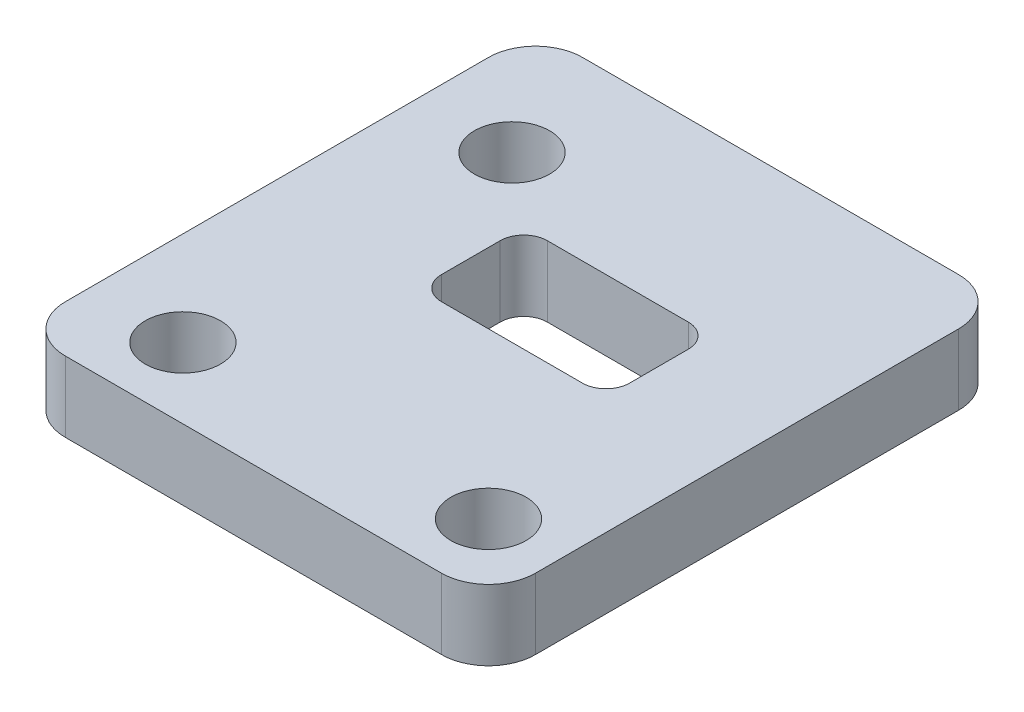
ISO-10303-21;
HEADER;
FILE_DESCRIPTION(('STEP AP214'),'2;1');
FILE_NAME('part.step','',(''),(''),'','','');
FILE_SCHEMA(('AUTOMOTIVE_DESIGN { 1 0 10303 214 1 1 1 1 }'));
ENDSEC;
DATA;
#1=APPLICATION_CONTEXT('core data for automotive mechanical design processes');
#2=APPLICATION_PROTOCOL_DEFINITION('international standard','automotive_design',2000,#1);
#3=PRODUCT_CONTEXT('',#1,'mechanical');
#4=PRODUCT('Part','Part','',(#3));
#5=PRODUCT_RELATED_PRODUCT_CATEGORY('part','',(#4));
#6=PRODUCT_DEFINITION_FORMATION('','',#4);
#7=PRODUCT_DEFINITION_CONTEXT('part definition',#1,'design');
#8=PRODUCT_DEFINITION('design','',#6,#7);
#9=PRODUCT_DEFINITION_SHAPE('','',#8);
#10=(LENGTH_UNIT() NAMED_UNIT(*) SI_UNIT(.MILLI.,.METRE.));
#11=(NAMED_UNIT(*) PLANE_ANGLE_UNIT() SI_UNIT($,.RADIAN.));
#12=(NAMED_UNIT(*) SI_UNIT($,.STERADIAN.) SOLID_ANGLE_UNIT());
#13=UNCERTAINTY_MEASURE_WITH_UNIT(LENGTH_MEASURE(1.E-05),#10,'distance_accuracy_value','');
#14=(GEOMETRIC_REPRESENTATION_CONTEXT(3) GLOBAL_UNCERTAINTY_ASSIGNED_CONTEXT((#13)) GLOBAL_UNIT_ASSIGNED_CONTEXT((#10,
#11,#12)) REPRESENTATION_CONTEXT('',''));
#15=CARTESIAN_POINT('',(0.,0.,0.));
#16=DIRECTION('',(0.,0.,1.));
#17=DIRECTION('',(1.,0.,0.));
#18=AXIS2_PLACEMENT_3D('',#15,#16,#17);
#19=CARTESIAN_POINT('',(5.,3.,0.));
#20=DIRECTION('',(-1.,0.,0.));
#21=DIRECTION('',(0.,0.,1.));
#22=AXIS2_PLACEMENT_3D('',#19,#20,#21);
#23=PLANE('',#22);
#24=DIRECTION('',(0.,0.,-1.));
#25=VECTOR('',#24,1.);
#26=CARTESIAN_POINT('',(5.,3.,0.));
#27=LINE('',#26,#25);
#28=CARTESIAN_POINT('',(5.,3.,-1.));
#29=VERTEX_POINT('',#28);
#30=CARTESIAN_POINT('',(5.,3.,-3.5));
#31=VERTEX_POINT('',#30);
#32=EDGE_CURVE('E277',#29,#31,#27,.T.);
#33=ORIENTED_EDGE('',*,*,#32,.T.);
#34=DIRECTION('',(0.,-1.,0.));
#35=VECTOR('',#34,1.);
#36=CARTESIAN_POINT('',(5.,3.,-3.5));
#37=LINE('',#36,#35);
#38=CARTESIAN_POINT('',(5.,0.,-3.5));
#39=VERTEX_POINT('',#38);
#40=EDGE_CURVE('E215',#31,#39,#37,.T.);
#41=ORIENTED_EDGE('',*,*,#40,.T.);
#42=DIRECTION('',(0.,0.,-1.));
#43=VECTOR('',#42,1.);
#44=CARTESIAN_POINT('',(5.,0.,0.));
#45=LINE('',#44,#43);
#46=CARTESIAN_POINT('',(5.,0.,-1.));
#47=VERTEX_POINT('',#46);
#48=EDGE_CURVE('E304',#47,#39,#45,.T.);
#49=ORIENTED_EDGE('',*,*,#48,.F.);
#50=DIRECTION('',(0.,-1.,0.));
#51=VECTOR('',#50,1.);
#52=CARTESIAN_POINT('',(5.,3.,-1.));
#53=LINE('',#52,#51);
#54=EDGE_CURVE('E213',#47,#29,#53,.F.);
#55=ORIENTED_EDGE('',*,*,#54,.T.);
#56=EDGE_LOOP('',(#33,#41,#49,#55));
#57=FACE_BOUND('',#56,.T.);
#58=ADVANCED_FACE('F39',(#57),#23,.T.);
#59=CARTESIAN_POINT('',(0.,3.,0.));
#60=DIRECTION('',(0.,0.,-1.));
#61=DIRECTION('',(-1.,0.,0.));
#62=AXIS2_PLACEMENT_3D('',#59,#60,#61);
#63=PLANE('',#62);
#64=DIRECTION('',(1.,0.,0.));
#65=VECTOR('',#64,1.);
#66=CARTESIAN_POINT('',(0.,0.,0.));
#67=LINE('',#66,#65);
#68=CARTESIAN_POINT('',(-2.,0.,0.));
#69=VERTEX_POINT('',#68);
#70=CARTESIAN_POINT('',(4.,0.,0.));
#71=VERTEX_POINT('',#70);
#72=EDGE_CURVE('E309',#69,#71,#67,.T.);
#73=ORIENTED_EDGE('',*,*,#72,.F.);
#74=DIRECTION('',(0.,-1.,0.));
#75=VECTOR('',#74,1.);
#76=CARTESIAN_POINT('',(-2.,3.,0.));
#77=LINE('',#76,#75);
#78=CARTESIAN_POINT('',(-2.,3.,0.));
#79=VERTEX_POINT('',#78);
#80=EDGE_CURVE('E59',#69,#79,#77,.F.);
#81=ORIENTED_EDGE('',*,*,#80,.T.);
#82=DIRECTION('',(1.,0.,0.));
#83=VECTOR('',#82,1.);
#84=CARTESIAN_POINT('',(0.,3.,0.));
#85=LINE('',#84,#83);
#86=CARTESIAN_POINT('',(4.,3.,0.));
#87=VERTEX_POINT('',#86);
#88=EDGE_CURVE('E280',#79,#87,#85,.T.);
#89=ORIENTED_EDGE('',*,*,#88,.T.);
#90=DIRECTION('',(0.,-1.,0.));
#91=VECTOR('',#90,1.);
#92=CARTESIAN_POINT('',(4.,0.,0.));
#93=LINE('',#92,#91);
#94=EDGE_CURVE('E228',#87,#71,#93,.T.);
#95=ORIENTED_EDGE('',*,*,#94,.T.);
#96=EDGE_LOOP('',(#73,#81,#89,#95));
#97=FACE_BOUND('',#96,.T.);
#98=ADVANCED_FACE('F351',(#97),#63,.T.);
#99=CARTESIAN_POINT('',(-3.,3.,0.));
#100=DIRECTION('',(-1.,0.,0.));
#101=DIRECTION('',(0.,0.,1.));
#102=AXIS2_PLACEMENT_3D('',#99,#100,#101);
#103=PLANE('',#102);
#104=DIRECTION('',(0.,0.,-1.));
#105=VECTOR('',#104,1.);
#106=CARTESIAN_POINT('',(-3.,0.,0.));
#107=LINE('',#106,#105);
#108=CARTESIAN_POINT('',(-3.,0.,-1.));
#109=VERTEX_POINT('',#108);
#110=CARTESIAN_POINT('',(-3.,0.,-3.5));
#111=VERTEX_POINT('',#110);
#112=EDGE_CURVE('E250',#109,#111,#107,.T.);
#113=ORIENTED_EDGE('',*,*,#112,.T.);
#114=DIRECTION('',(0.,-1.,0.));
#115=VECTOR('',#114,1.);
#116=CARTESIAN_POINT('',(-3.,3.,-3.5));
#117=LINE('',#116,#115);
#118=CARTESIAN_POINT('',(-3.,3.,-3.5));
#119=VERTEX_POINT('',#118);
#120=EDGE_CURVE('E226',#111,#119,#117,.F.);
#121=ORIENTED_EDGE('',*,*,#120,.T.);
#122=DIRECTION('',(0.,0.,-1.));
#123=VECTOR('',#122,1.);
#124=CARTESIAN_POINT('',(-3.,3.,0.));
#125=LINE('',#124,#123);
#126=CARTESIAN_POINT('',(-3.,3.,-1.));
#127=VERTEX_POINT('',#126);
#128=EDGE_CURVE('E282',#127,#119,#125,.T.);
#129=ORIENTED_EDGE('',*,*,#128,.F.);
#130=DIRECTION('',(0.,-1.,0.));
#131=VECTOR('',#130,1.);
#132=CARTESIAN_POINT('',(-3.,3.,-1.));
#133=LINE('',#132,#131);
#134=EDGE_CURVE('E223',#127,#109,#133,.T.);
#135=ORIENTED_EDGE('',*,*,#134,.T.);
#136=EDGE_LOOP('',(#113,#121,#129,#135));
#137=FACE_BOUND('',#136,.T.);
#138=ADVANCED_FACE('F346',(#137),#103,.F.);
#139=CARTESIAN_POINT('',(10.,3.,0.));
#140=DIRECTION('',(1.,0.,0.));
#141=DIRECTION('',(0.,0.,-1.));
#142=AXIS2_PLACEMENT_3D('',#139,#140,#141);
#143=PLANE('',#142);
#144=DIRECTION('',(0.,0.,1.));
#145=VECTOR('',#144,1.);
#146=CARTESIAN_POINT('',(10.,3.,0.));
#147=LINE('',#146,#145);
#148=CARTESIAN_POINT('',(10.,3.,-10.));
#149=VERTEX_POINT('',#148);
#150=CARTESIAN_POINT('',(10.,3.,8.));
#151=VERTEX_POINT('',#150);
#152=EDGE_CURVE('E262',#149,#151,#147,.T.);
#153=ORIENTED_EDGE('',*,*,#152,.T.);
#154=DIRECTION('',(0.,-1.,0.));
#155=VECTOR('',#154,1.);
#156=CARTESIAN_POINT('',(10.,0.,8.));
#157=LINE('',#156,#155);
#158=CARTESIAN_POINT('',(10.,0.,8.));
#159=VERTEX_POINT('',#158);
#160=EDGE_CURVE('E173',#151,#159,#157,.T.);
#161=ORIENTED_EDGE('',*,*,#160,.T.);
#162=DIRECTION('',(0.,0.,1.));
#163=VECTOR('',#162,1.);
#164=CARTESIAN_POINT('',(10.,0.,0.));
#165=LINE('',#164,#163);
#166=CARTESIAN_POINT('',(10.,0.,-10.));
#167=VERTEX_POINT('',#166);
#168=EDGE_CURVE('E156',#167,#159,#165,.T.);
#169=ORIENTED_EDGE('',*,*,#168,.F.);
#170=DIRECTION('',(0.,-1.,0.));
#171=VECTOR('',#170,1.);
#172=CARTESIAN_POINT('',(10.,3.,-10.));
#173=LINE('',#172,#171);
#174=EDGE_CURVE('E170',#167,#149,#173,.F.);
#175=ORIENTED_EDGE('',*,*,#174,.T.);
#176=EDGE_LOOP('',(#153,#161,#169,#175));
#177=FACE_BOUND('',#176,.T.);
#178=ADVANCED_FACE('F169',(#177),#143,.T.);
#179=CARTESIAN_POINT('',(0.,3.,-12.));
#180=DIRECTION('',(0.,0.,-1.));
#181=DIRECTION('',(-1.,0.,0.));
#182=AXIS2_PLACEMENT_3D('',#179,#180,#181);
#183=PLANE('',#182);
#184=DIRECTION('',(1.,0.,0.));
#185=VECTOR('',#184,1.);
#186=CARTESIAN_POINT('',(0.,3.,-12.));
#187=LINE('',#186,#185);
#188=CARTESIAN_POINT('',(-8.,3.,-12.));
#189=VERTEX_POINT('',#188);
#190=CARTESIAN_POINT('',(8.,3.,-12.));
#191=VERTEX_POINT('',#190);
#192=EDGE_CURVE('E266',#189,#191,#187,.T.);
#193=ORIENTED_EDGE('',*,*,#192,.T.);
#194=DIRECTION('',(0.,-1.,0.));
#195=VECTOR('',#194,1.);
#196=CARTESIAN_POINT('',(8.,3.,-12.));
#197=LINE('',#196,#195);
#198=CARTESIAN_POINT('',(8.,0.,-12.));
#199=VERTEX_POINT('',#198);
#200=EDGE_CURVE('E211',#191,#199,#197,.T.);
#201=ORIENTED_EDGE('',*,*,#200,.T.);
#202=DIRECTION('',(1.,0.,0.));
#203=VECTOR('',#202,1.);
#204=CARTESIAN_POINT('',(0.,0.,-12.));
#205=LINE('',#204,#203);
#206=CARTESIAN_POINT('',(-8.,0.,-12.));
#207=VERTEX_POINT('',#206);
#208=EDGE_CURVE('E158',#207,#199,#205,.T.);
#209=ORIENTED_EDGE('',*,*,#208,.F.);
#210=DIRECTION('',(0.,-1.,0.));
#211=VECTOR('',#210,1.);
#212=CARTESIAN_POINT('',(-8.,3.,-12.));
#213=LINE('',#212,#211);
#214=EDGE_CURVE('E209',#207,#189,#213,.F.);
#215=ORIENTED_EDGE('',*,*,#214,.T.);
#216=EDGE_LOOP('',(#193,#201,#209,#215));
#217=FACE_BOUND('',#216,.T.);
#218=ADVANCED_FACE('F375',(#217),#183,.T.);
#219=CARTESIAN_POINT('',(-10.,3.,0.));
#220=DIRECTION('',(-1.,0.,0.));
#221=DIRECTION('',(0.,0.,1.));
#222=AXIS2_PLACEMENT_3D('',#219,#220,#221);
#223=PLANE('',#222);
#224=DIRECTION('',(0.,0.,-1.));
#225=VECTOR('',#224,1.);
#226=CARTESIAN_POINT('',(-10.,0.,0.));
#227=LINE('',#226,#225);
#228=CARTESIAN_POINT('',(-10.,0.,8.));
#229=VERTEX_POINT('',#228);
#230=CARTESIAN_POINT('',(-10.,0.,-10.));
#231=VERTEX_POINT('',#230);
#232=EDGE_CURVE('E305',#229,#231,#227,.T.);
#233=ORIENTED_EDGE('',*,*,#232,.F.);
#234=DIRECTION('',(0.,-1.,0.));
#235=VECTOR('',#234,1.);
#236=CARTESIAN_POINT('',(-10.,3.,8.));
#237=LINE('',#236,#235);
#238=CARTESIAN_POINT('',(-10.,3.,8.));
#239=VERTEX_POINT('',#238);
#240=EDGE_CURVE('E207',#229,#239,#237,.F.);
#241=ORIENTED_EDGE('',*,*,#240,.T.);
#242=DIRECTION('',(0.,0.,-1.));
#243=VECTOR('',#242,1.);
#244=CARTESIAN_POINT('',(-10.,3.,0.));
#245=LINE('',#244,#243);
#246=CARTESIAN_POINT('',(-10.,3.,-10.));
#247=VERTEX_POINT('',#246);
#248=EDGE_CURVE('E271',#239,#247,#245,.T.);
#249=ORIENTED_EDGE('',*,*,#248,.T.);
#250=DIRECTION('',(0.,-1.,0.));
#251=VECTOR('',#250,1.);
#252=CARTESIAN_POINT('',(-10.,3.,-10.));
#253=LINE('',#252,#251);
#254=EDGE_CURVE('E204',#247,#231,#253,.T.);
#255=ORIENTED_EDGE('',*,*,#254,.T.);
#256=EDGE_LOOP('',(#233,#241,#249,#255));
#257=FACE_BOUND('',#256,.T.);
#258=ADVANCED_FACE('F371',(#257),#223,.T.);
#259=CARTESIAN_POINT('',(-6.,3.,-7.));
#260=DIRECTION('',(0.,-1.,0.));
#261=DIRECTION('',(0.,0.,-1.));
#262=AXIS2_PLACEMENT_3D('',#259,#260,#261);
#263=CYLINDRICAL_SURFACE('',#262,1.6);
#264=CARTESIAN_POINT('',(-6.,3.,-7.));
#265=DIRECTION('',(0.,1.,0.));
#266=DIRECTION('',(0.,0.,1.));
#267=AXIS2_PLACEMENT_3D('',#264,#265,#266);
#268=CIRCLE('',#267,1.6);
#269=CARTESIAN_POINT('',(-6.,3.,-5.4));
#270=VERTEX_POINT('',#269);
#271=EDGE_CURVE('E183',#270,#270,#268,.T.);
#272=ORIENTED_EDGE('',*,*,#271,.T.);
#273=EDGE_LOOP('',(#272));
#274=FACE_BOUND('',#273,.T.);
#275=CARTESIAN_POINT('',(-6.,0.,-7.));
#276=DIRECTION('',(0.,1.,0.));
#277=DIRECTION('',(0.,0.,1.));
#278=AXIS2_PLACEMENT_3D('',#275,#276,#277);
#279=CIRCLE('',#278,1.6);
#280=CARTESIAN_POINT('',(-6.,0.,-5.4));
#281=VERTEX_POINT('',#280);
#282=EDGE_CURVE('E249',#281,#281,#279,.T.);
#283=ORIENTED_EDGE('',*,*,#282,.F.);
#284=EDGE_LOOP('',(#283));
#285=FACE_BOUND('',#284,.T.);
#286=ADVANCED_FACE('F374',(#274,#285),#263,.F.);
#287=CARTESIAN_POINT('',(0.,3.,-4.5));
#288=DIRECTION('',(0.,0.,-1.));
#289=DIRECTION('',(-1.,0.,0.));
#290=AXIS2_PLACEMENT_3D('',#287,#288,#289);
#291=PLANE('',#290);
#292=DIRECTION('',(1.,0.,0.));
#293=VECTOR('',#292,1.);
#294=CARTESIAN_POINT('',(0.,0.,-4.5));
#295=LINE('',#294,#293);
#296=CARTESIAN_POINT('',(-2.,0.,-4.5));
#297=VERTEX_POINT('',#296);
#298=CARTESIAN_POINT('',(4.,0.,-4.5));
#299=VERTEX_POINT('',#298);
#300=EDGE_CURVE('E245',#297,#299,#295,.T.);
#301=ORIENTED_EDGE('',*,*,#300,.T.);
#302=DIRECTION('',(0.,-1.,0.));
#303=VECTOR('',#302,1.);
#304=CARTESIAN_POINT('',(4.,3.,-4.5));
#305=LINE('',#304,#303);
#306=CARTESIAN_POINT('',(4.,3.,-4.5));
#307=VERTEX_POINT('',#306);
#308=EDGE_CURVE('E221',#299,#307,#305,.F.);
#309=ORIENTED_EDGE('',*,*,#308,.T.);
#310=DIRECTION('',(1.,0.,0.));
#311=VECTOR('',#310,1.);
#312=CARTESIAN_POINT('',(0.,3.,-4.5));
#313=LINE('',#312,#311);
#314=CARTESIAN_POINT('',(-2.,3.,-4.5));
#315=VERTEX_POINT('',#314);
#316=EDGE_CURVE('E285',#315,#307,#313,.T.);
#317=ORIENTED_EDGE('',*,*,#316,.F.);
#318=DIRECTION('',(0.,-1.,0.));
#319=VECTOR('',#318,1.);
#320=CARTESIAN_POINT('',(-2.,0.,-4.5));
#321=LINE('',#320,#319);
#322=EDGE_CURVE('E218',#315,#297,#321,.T.);
#323=ORIENTED_EDGE('',*,*,#322,.T.);
#324=EDGE_LOOP('',(#301,#309,#317,#323));
#325=FACE_BOUND('',#324,.T.);
#326=ADVANCED_FACE('F338',(#325),#291,.F.);
#327=CARTESIAN_POINT('',(0.,3.,10.));
#328=DIRECTION('',(0.,0.,-1.));
#329=DIRECTION('',(-1.,0.,0.));
#330=AXIS2_PLACEMENT_3D('',#327,#328,#329);
#331=PLANE('',#330);
#332=DIRECTION('',(1.,0.,0.));
#333=VECTOR('',#332,1.);
#334=CARTESIAN_POINT('',(0.,0.,10.));
#335=LINE('',#334,#333);
#336=CARTESIAN_POINT('',(-8.,0.,10.));
#337=VERTEX_POINT('',#336);
#338=CARTESIAN_POINT('',(8.,0.,10.));
#339=VERTEX_POINT('',#338);
#340=EDGE_CURVE('E301',#337,#339,#335,.T.);
#341=ORIENTED_EDGE('',*,*,#340,.T.);
#342=DIRECTION('',(0.,-1.,0.));
#343=VECTOR('',#342,1.);
#344=CARTESIAN_POINT('',(8.,3.,10.));
#345=LINE('',#344,#343);
#346=CARTESIAN_POINT('',(8.,3.,10.));
#347=VERTEX_POINT('',#346);
#348=EDGE_CURVE('E195',#339,#347,#345,.F.);
#349=ORIENTED_EDGE('',*,*,#348,.T.);
#350=DIRECTION('',(1.,0.,0.));
#351=VECTOR('',#350,1.);
#352=CARTESIAN_POINT('',(0.,3.,10.));
#353=LINE('',#352,#351);
#354=CARTESIAN_POINT('',(-8.,3.,10.));
#355=VERTEX_POINT('',#354);
#356=EDGE_CURVE('E274',#355,#347,#353,.T.);
#357=ORIENTED_EDGE('',*,*,#356,.F.);
#358=DIRECTION('',(0.,-1.,0.));
#359=VECTOR('',#358,1.);
#360=CARTESIAN_POINT('',(-8.,0.,10.));
#361=LINE('',#360,#359);
#362=EDGE_CURVE('E192',#355,#337,#361,.T.);
#363=ORIENTED_EDGE('',*,*,#362,.T.);
#364=EDGE_LOOP('',(#341,#349,#357,#363));
#365=FACE_BOUND('',#364,.T.);
#366=ADVANCED_FACE('F366',(#365),#331,.F.);
#367=CARTESIAN_POINT('',(7.,3.,7.));
#368=DIRECTION('',(0.,-1.,0.));
#369=DIRECTION('',(0.,0.,-1.));
#370=AXIS2_PLACEMENT_3D('',#367,#368,#369);
#371=CYLINDRICAL_SURFACE('',#370,1.6);
#372=CARTESIAN_POINT('',(7.,3.,7.));
#373=DIRECTION('',(0.,1.,0.));
#374=DIRECTION('',(0.,0.,1.));
#375=AXIS2_PLACEMENT_3D('',#372,#373,#374);
#376=CIRCLE('',#375,1.6);
#377=CARTESIAN_POINT('',(7.,3.,8.6));
#378=VERTEX_POINT('',#377);
#379=EDGE_CURVE('E258',#378,#378,#376,.T.);
#380=ORIENTED_EDGE('',*,*,#379,.T.);
#381=EDGE_LOOP('',(#380));
#382=FACE_BOUND('',#381,.T.);
#383=CARTESIAN_POINT('',(7.,0.,7.));
#384=DIRECTION('',(0.,1.,0.));
#385=DIRECTION('',(0.,0.,1.));
#386=AXIS2_PLACEMENT_3D('',#383,#384,#385);
#387=CIRCLE('',#386,1.6);
#388=CARTESIAN_POINT('',(7.,0.,8.6));
#389=VERTEX_POINT('',#388);
#390=EDGE_CURVE('E174',#389,#389,#387,.T.);
#391=ORIENTED_EDGE('',*,*,#390,.F.);
#392=EDGE_LOOP('',(#391));
#393=FACE_BOUND('',#392,.T.);
#394=ADVANCED_FACE('F369',(#382,#393),#371,.F.);
#395=CARTESIAN_POINT('',(-6.,3.,7.));
#396=DIRECTION('',(0.,-1.,0.));
#397=DIRECTION('',(0.,0.,-1.));
#398=AXIS2_PLACEMENT_3D('',#395,#396,#397);
#399=CYLINDRICAL_SURFACE('',#398,1.6);
#400=CARTESIAN_POINT('',(-6.,3.,7.));
#401=DIRECTION('',(0.,1.,0.));
#402=DIRECTION('',(0.,0.,1.));
#403=AXIS2_PLACEMENT_3D('',#400,#401,#402);
#404=CIRCLE('',#403,1.6);
#405=CARTESIAN_POINT('',(-6.,3.,8.6));
#406=VERTEX_POINT('',#405);
#407=EDGE_CURVE('E179',#406,#406,#404,.F.);
#408=ORIENTED_EDGE('',*,*,#407,.F.);
#409=EDGE_LOOP('',(#408));
#410=FACE_BOUND('',#409,.T.);
#411=CARTESIAN_POINT('',(-6.,0.,7.));
#412=DIRECTION('',(0.,1.,0.));
#413=DIRECTION('',(0.,0.,1.));
#414=AXIS2_PLACEMENT_3D('',#411,#412,#413);
#415=CIRCLE('',#414,1.6);
#416=CARTESIAN_POINT('',(-6.,0.,8.6));
#417=VERTEX_POINT('',#416);
#418=EDGE_CURVE('E186',#417,#417,#415,.F.);
#419=ORIENTED_EDGE('',*,*,#418,.T.);
#420=EDGE_LOOP('',(#419));
#421=FACE_BOUND('',#420,.T.);
#422=ADVANCED_FACE('F384',(#410,#421),#399,.F.);
#423=CARTESIAN_POINT('',(0.,3.,0.));
#424=DIRECTION('',(0.,1.,0.));
#425=DIRECTION('',(0.,0.,1.));
#426=AXIS2_PLACEMENT_3D('',#423,#424,#425);
#427=PLANE('',#426);
#428=ORIENTED_EDGE('',*,*,#379,.F.);
#429=EDGE_LOOP('',(#428));
#430=FACE_BOUND('',#429,.T.);
#431=ORIENTED_EDGE('',*,*,#356,.T.);
#432=CARTESIAN_POINT('',(8.,3.,8.));
#433=DIRECTION('',(0.,1.,0.));
#434=DIRECTION('',(0.,0.,1.));
#435=AXIS2_PLACEMENT_3D('',#432,#433,#434);
#436=CIRCLE('',#435,2.);
#437=EDGE_CURVE('E202',#347,#151,#436,.T.);
#438=ORIENTED_EDGE('',*,*,#437,.T.);
#439=ORIENTED_EDGE('',*,*,#152,.F.);
#440=CARTESIAN_POINT('',(8.,3.,-10.));
#441=DIRECTION('',(0.,1.,0.));
#442=DIRECTION('',(0.,0.,1.));
#443=AXIS2_PLACEMENT_3D('',#440,#441,#442);
#444=CIRCLE('',#443,2.);
#445=EDGE_CURVE('E178',#149,#191,#444,.T.);
#446=ORIENTED_EDGE('',*,*,#445,.T.);
#447=ORIENTED_EDGE('',*,*,#192,.F.);
#448=CARTESIAN_POINT('',(-8.,3.,-10.));
#449=DIRECTION('',(0.,1.,0.));
#450=DIRECTION('',(0.,0.,1.));
#451=AXIS2_PLACEMENT_3D('',#448,#449,#450);
#452=CIRCLE('',#451,2.);
#453=EDGE_CURVE('E197',#189,#247,#452,.T.);
#454=ORIENTED_EDGE('',*,*,#453,.T.);
#455=ORIENTED_EDGE('',*,*,#248,.F.);
#456=CARTESIAN_POINT('',(-8.,3.,8.));
#457=DIRECTION('',(0.,1.,0.));
#458=DIRECTION('',(0.,0.,1.));
#459=AXIS2_PLACEMENT_3D('',#456,#457,#458);
#460=CIRCLE('',#459,2.);
#461=EDGE_CURVE('E200',#239,#355,#460,.T.);
#462=ORIENTED_EDGE('',*,*,#461,.T.);
#463=EDGE_LOOP('',(#431,#438,#439,#446,#447,#454,#455,#462));
#464=FACE_BOUND('',#463,.T.);
#465=ORIENTED_EDGE('',*,*,#32,.F.);
#466=CARTESIAN_POINT('',(4.,3.,-1.));
#467=DIRECTION('',(0.,1.,0.));
#468=DIRECTION('',(0.,0.,1.));
#469=AXIS2_PLACEMENT_3D('',#466,#467,#468);
#470=CIRCLE('',#469,1.);
#471=EDGE_CURVE('E12',#29,#87,#470,.F.);
#472=ORIENTED_EDGE('',*,*,#471,.T.);
#473=ORIENTED_EDGE('',*,*,#88,.F.);
#474=CARTESIAN_POINT('',(-2.,3.,-1.));
#475=DIRECTION('',(0.,1.,0.));
#476=DIRECTION('',(0.,0.,1.));
#477=AXIS2_PLACEMENT_3D('',#474,#475,#476);
#478=CIRCLE('',#477,1.);
#479=EDGE_CURVE('E315',#79,#127,#478,.F.);
#480=ORIENTED_EDGE('',*,*,#479,.T.);
#481=ORIENTED_EDGE('',*,*,#128,.T.);
#482=CARTESIAN_POINT('',(-2.,3.,-3.5));
#483=DIRECTION('',(0.,1.,0.));
#484=DIRECTION('',(0.,0.,1.));
#485=AXIS2_PLACEMENT_3D('',#482,#483,#484);
#486=CIRCLE('',#485,1.);
#487=EDGE_CURVE('E320',#119,#315,#486,.F.);
#488=ORIENTED_EDGE('',*,*,#487,.T.);
#489=ORIENTED_EDGE('',*,*,#316,.T.);
#490=CARTESIAN_POINT('',(4.,3.,-3.5));
#491=DIRECTION('',(0.,1.,0.));
#492=DIRECTION('',(0.,0.,1.));
#493=AXIS2_PLACEMENT_3D('',#490,#491,#492);
#494=CIRCLE('',#493,1.);
#495=EDGE_CURVE('E235',#307,#31,#494,.F.);
#496=ORIENTED_EDGE('',*,*,#495,.T.);
#497=EDGE_LOOP('',(#465,#472,#473,#480,#481,#488,#489,#496));
#498=FACE_BOUND('',#497,.T.);
#499=ORIENTED_EDGE('',*,*,#271,.F.);
#500=EDGE_LOOP('',(#499));
#501=FACE_BOUND('',#500,.T.);
#502=ORIENTED_EDGE('',*,*,#407,.T.);
#503=EDGE_LOOP('',(#502));
#504=FACE_BOUND('',#503,.T.);
#505=ADVANCED_FACE('F327',(#430,#464,#498,#501,#504),#427,.T.);
#506=CARTESIAN_POINT('',(0.,0.,0.));
#507=DIRECTION('',(0.,1.,0.));
#508=DIRECTION('',(0.,0.,1.));
#509=AXIS2_PLACEMENT_3D('',#506,#507,#508);
#510=PLANE('',#509);
#511=ORIENTED_EDGE('',*,*,#390,.T.);
#512=EDGE_LOOP('',(#511));
#513=FACE_BOUND('',#512,.T.);
#514=ORIENTED_EDGE('',*,*,#168,.T.);
#515=CARTESIAN_POINT('',(8.,0.,8.));
#516=DIRECTION('',(0.,1.,0.));
#517=DIRECTION('',(0.,0.,1.));
#518=AXIS2_PLACEMENT_3D('',#515,#516,#517);
#519=CIRCLE('',#518,2.);
#520=EDGE_CURVE('E190',#159,#339,#519,.F.);
#521=ORIENTED_EDGE('',*,*,#520,.T.);
#522=ORIENTED_EDGE('',*,*,#340,.F.);
#523=CARTESIAN_POINT('',(-8.,0.,8.));
#524=DIRECTION('',(0.,1.,0.));
#525=DIRECTION('',(0.,0.,1.));
#526=AXIS2_PLACEMENT_3D('',#523,#524,#525);
#527=CIRCLE('',#526,2.);
#528=EDGE_CURVE('E163',#337,#229,#527,.F.);
#529=ORIENTED_EDGE('',*,*,#528,.T.);
#530=ORIENTED_EDGE('',*,*,#232,.T.);
#531=CARTESIAN_POINT('',(-8.,0.,-10.));
#532=DIRECTION('',(0.,1.,0.));
#533=DIRECTION('',(0.,0.,1.));
#534=AXIS2_PLACEMENT_3D('',#531,#532,#533);
#535=CIRCLE('',#534,2.);
#536=EDGE_CURVE('E164',#231,#207,#535,.F.);
#537=ORIENTED_EDGE('',*,*,#536,.T.);
#538=ORIENTED_EDGE('',*,*,#208,.T.);
#539=CARTESIAN_POINT('',(8.,0.,-10.));
#540=DIRECTION('',(0.,1.,0.));
#541=DIRECTION('',(0.,0.,1.));
#542=AXIS2_PLACEMENT_3D('',#539,#540,#541);
#543=CIRCLE('',#542,2.);
#544=EDGE_CURVE('E152',#199,#167,#543,.F.);
#545=ORIENTED_EDGE('',*,*,#544,.T.);
#546=EDGE_LOOP('',(#514,#521,#522,#529,#530,#537,#538,#545));
#547=FACE_BOUND('',#546,.T.);
#548=ORIENTED_EDGE('',*,*,#72,.T.);
#549=CARTESIAN_POINT('',(4.,0.,-1.));
#550=DIRECTION('',(0.,1.,0.));
#551=DIRECTION('',(0.,0.,1.));
#552=AXIS2_PLACEMENT_3D('',#549,#550,#551);
#553=CIRCLE('',#552,1.);
#554=EDGE_CURVE('E47',#71,#47,#553,.T.);
#555=ORIENTED_EDGE('',*,*,#554,.T.);
#556=ORIENTED_EDGE('',*,*,#48,.T.);
#557=CARTESIAN_POINT('',(4.,0.,-3.5));
#558=DIRECTION('',(0.,1.,0.));
#559=DIRECTION('',(0.,0.,1.));
#560=AXIS2_PLACEMENT_3D('',#557,#558,#559);
#561=CIRCLE('',#560,1.);
#562=EDGE_CURVE('E232',#39,#299,#561,.T.);
#563=ORIENTED_EDGE('',*,*,#562,.T.);
#564=ORIENTED_EDGE('',*,*,#300,.F.);
#565=CARTESIAN_POINT('',(-2.,0.,-3.5));
#566=DIRECTION('',(0.,1.,0.));
#567=DIRECTION('',(0.,0.,1.));
#568=AXIS2_PLACEMENT_3D('',#565,#566,#567);
#569=CIRCLE('',#568,1.);
#570=EDGE_CURVE('E321',#297,#111,#569,.T.);
#571=ORIENTED_EDGE('',*,*,#570,.T.);
#572=ORIENTED_EDGE('',*,*,#112,.F.);
#573=CARTESIAN_POINT('',(-2.,0.,-1.));
#574=DIRECTION('',(0.,1.,0.));
#575=DIRECTION('',(0.,0.,1.));
#576=AXIS2_PLACEMENT_3D('',#573,#574,#575);
#577=CIRCLE('',#576,1.);
#578=EDGE_CURVE('E317',#109,#69,#577,.T.);
#579=ORIENTED_EDGE('',*,*,#578,.T.);
#580=EDGE_LOOP('',(#548,#555,#556,#563,#564,#571,#572,#579));
#581=FACE_BOUND('',#580,.T.);
#582=ORIENTED_EDGE('',*,*,#282,.T.);
#583=EDGE_LOOP('',(#582));
#584=FACE_BOUND('',#583,.T.);
#585=ORIENTED_EDGE('',*,*,#418,.F.);
#586=EDGE_LOOP('',(#585));
#587=FACE_BOUND('',#586,.T.);
#588=ADVANCED_FACE('F154',(#513,#547,#581,#584,#587),#510,.F.);
#589=CARTESIAN_POINT('',(8.,3.,8.));
#590=DIRECTION('',(0.,1.,0.));
#591=DIRECTION('',(0.,0.,1.));
#592=AXIS2_PLACEMENT_3D('',#589,#590,#591);
#593=CYLINDRICAL_SURFACE('',#592,2.);
#594=ORIENTED_EDGE('',*,*,#437,.F.);
#595=ORIENTED_EDGE('',*,*,#348,.F.);
#596=ORIENTED_EDGE('',*,*,#520,.F.);
#597=ORIENTED_EDGE('',*,*,#160,.F.);
#598=EDGE_LOOP('',(#594,#595,#596,#597));
#599=FACE_BOUND('',#598,.T.);
#600=ADVANCED_FACE('F385',(#599),#593,.T.);
#601=CARTESIAN_POINT('',(-8.,3.,8.));
#602=DIRECTION('',(0.,1.,0.));
#603=DIRECTION('',(0.,0.,1.));
#604=AXIS2_PLACEMENT_3D('',#601,#602,#603);
#605=CYLINDRICAL_SURFACE('',#604,2.);
#606=ORIENTED_EDGE('',*,*,#461,.F.);
#607=ORIENTED_EDGE('',*,*,#240,.F.);
#608=ORIENTED_EDGE('',*,*,#528,.F.);
#609=ORIENTED_EDGE('',*,*,#362,.F.);
#610=EDGE_LOOP('',(#606,#607,#608,#609));
#611=FACE_BOUND('',#610,.T.);
#612=ADVANCED_FACE('F388',(#611),#605,.T.);
#613=CARTESIAN_POINT('',(8.,3.,-10.));
#614=DIRECTION('',(0.,-1.,0.));
#615=DIRECTION('',(0.,0.,-1.));
#616=AXIS2_PLACEMENT_3D('',#613,#614,#615);
#617=CYLINDRICAL_SURFACE('',#616,2.);
#618=ORIENTED_EDGE('',*,*,#445,.F.);
#619=ORIENTED_EDGE('',*,*,#174,.F.);
#620=ORIENTED_EDGE('',*,*,#544,.F.);
#621=ORIENTED_EDGE('',*,*,#200,.F.);
#622=EDGE_LOOP('',(#618,#619,#620,#621));
#623=FACE_BOUND('',#622,.T.);
#624=ADVANCED_FACE('F177',(#623),#617,.T.);
#625=CARTESIAN_POINT('',(-8.,3.,-10.));
#626=DIRECTION('',(0.,-1.,0.));
#627=DIRECTION('',(0.,0.,-1.));
#628=AXIS2_PLACEMENT_3D('',#625,#626,#627);
#629=CYLINDRICAL_SURFACE('',#628,2.);
#630=ORIENTED_EDGE('',*,*,#453,.F.);
#631=ORIENTED_EDGE('',*,*,#214,.F.);
#632=ORIENTED_EDGE('',*,*,#536,.F.);
#633=ORIENTED_EDGE('',*,*,#254,.F.);
#634=EDGE_LOOP('',(#630,#631,#632,#633));
#635=FACE_BOUND('',#634,.T.);
#636=ADVANCED_FACE('F395',(#635),#629,.T.);
#637=CARTESIAN_POINT('',(4.,3.,-3.5));
#638=DIRECTION('',(0.,-1.,0.));
#639=DIRECTION('',(0.,0.,-1.));
#640=AXIS2_PLACEMENT_3D('',#637,#638,#639);
#641=CYLINDRICAL_SURFACE('',#640,1.);
#642=ORIENTED_EDGE('',*,*,#495,.F.);
#643=ORIENTED_EDGE('',*,*,#308,.F.);
#644=ORIENTED_EDGE('',*,*,#562,.F.);
#645=ORIENTED_EDGE('',*,*,#40,.F.);
#646=EDGE_LOOP('',(#642,#643,#644,#645));
#647=FACE_BOUND('',#646,.T.);
#648=ADVANCED_FACE('F336',(#647),#641,.F.);
#649=CARTESIAN_POINT('',(-2.,3.,-3.5));
#650=DIRECTION('',(0.,1.,0.));
#651=DIRECTION('',(0.,0.,1.));
#652=AXIS2_PLACEMENT_3D('',#649,#650,#651);
#653=CYLINDRICAL_SURFACE('',#652,1.);
#654=ORIENTED_EDGE('',*,*,#487,.F.);
#655=ORIENTED_EDGE('',*,*,#120,.F.);
#656=ORIENTED_EDGE('',*,*,#570,.F.);
#657=ORIENTED_EDGE('',*,*,#322,.F.);
#658=EDGE_LOOP('',(#654,#655,#656,#657));
#659=FACE_BOUND('',#658,.T.);
#660=ADVANCED_FACE('F342',(#659),#653,.F.);
#661=CARTESIAN_POINT('',(-2.,3.,-1.));
#662=DIRECTION('',(0.,-1.,0.));
#663=DIRECTION('',(0.,0.,-1.));
#664=AXIS2_PLACEMENT_3D('',#661,#662,#663);
#665=CYLINDRICAL_SURFACE('',#664,1.);
#666=ORIENTED_EDGE('',*,*,#479,.F.);
#667=ORIENTED_EDGE('',*,*,#80,.F.);
#668=ORIENTED_EDGE('',*,*,#578,.F.);
#669=ORIENTED_EDGE('',*,*,#134,.F.);
#670=EDGE_LOOP('',(#666,#667,#668,#669));
#671=FACE_BOUND('',#670,.T.);
#672=ADVANCED_FACE('F350',(#671),#665,.F.);
#673=CARTESIAN_POINT('',(4.,3.,-1.));
#674=DIRECTION('',(0.,1.,0.));
#675=DIRECTION('',(0.,0.,1.));
#676=AXIS2_PLACEMENT_3D('',#673,#674,#675);
#677=CYLINDRICAL_SURFACE('',#676,1.);
#678=ORIENTED_EDGE('',*,*,#471,.F.);
#679=ORIENTED_EDGE('',*,*,#54,.F.);
#680=ORIENTED_EDGE('',*,*,#554,.F.);
#681=ORIENTED_EDGE('',*,*,#94,.F.);
#682=EDGE_LOOP('',(#678,#679,#680,#681));
#683=FACE_BOUND('',#682,.T.);
#684=ADVANCED_FACE('F41',(#683),#677,.F.);
#685=CLOSED_SHELL('',(#58,#98,#138,#178,#218,#258,#286,#326,#366,#394,#422,#505,#588,#600,#612,
#624,#636,#648,#660,#672,#684));
#686=MANIFOLD_SOLID_BREP('B2',#685);
#687=ADVANCED_BREP_SHAPE_REPRESENTATION('',(#18,#686),#14);
#688=SHAPE_DEFINITION_REPRESENTATION(#9,#687);
ENDSEC;
END-ISO-10303-21;
